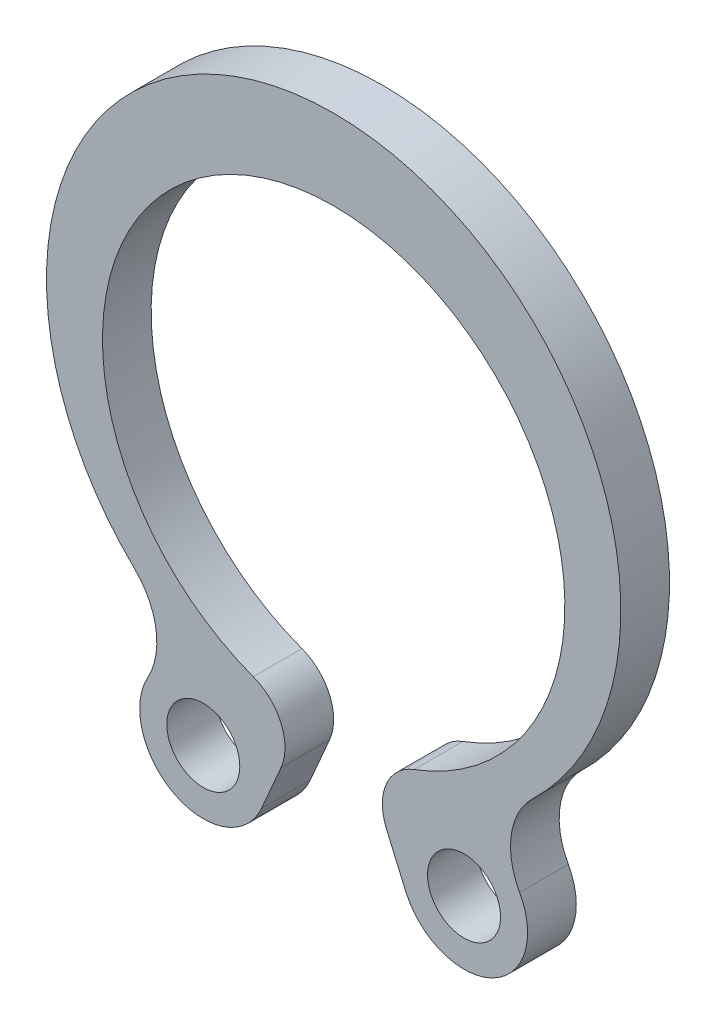
ISO-10303-21;
HEADER;
FILE_DESCRIPTION(('STEP AP214'),'2;1');
FILE_NAME('part.step','',(''),(''),'','','');
FILE_SCHEMA(('AUTOMOTIVE_DESIGN { 1 0 10303 214 1 1 1 1 }'));
ENDSEC;
DATA;
#1=APPLICATION_CONTEXT('core data for automotive mechanical design processes');
#2=APPLICATION_PROTOCOL_DEFINITION('international standard','automotive_design',2000,#1);
#3=PRODUCT_CONTEXT('',#1,'mechanical');
#4=PRODUCT('Part','Part','',(#3));
#5=PRODUCT_RELATED_PRODUCT_CATEGORY('part','',(#4));
#6=PRODUCT_DEFINITION_FORMATION('','',#4);
#7=PRODUCT_DEFINITION_CONTEXT('part definition',#1,'design');
#8=PRODUCT_DEFINITION('design','',#6,#7);
#9=PRODUCT_DEFINITION_SHAPE('','',#8);
#10=(LENGTH_UNIT() NAMED_UNIT(*) SI_UNIT(.MILLI.,.METRE.));
#11=(NAMED_UNIT(*) PLANE_ANGLE_UNIT() SI_UNIT($,.RADIAN.));
#12=(NAMED_UNIT(*) SI_UNIT($,.STERADIAN.) SOLID_ANGLE_UNIT());
#13=UNCERTAINTY_MEASURE_WITH_UNIT(LENGTH_MEASURE(1.E-05),#10,'distance_accuracy_value','');
#14=(GEOMETRIC_REPRESENTATION_CONTEXT(3) GLOBAL_UNCERTAINTY_ASSIGNED_CONTEXT((#13)) GLOBAL_UNIT_ASSIGNED_CONTEXT((#10,
#11,#12)) REPRESENTATION_CONTEXT('',''));
#15=CARTESIAN_POINT('',(0.,0.,0.));
#16=DIRECTION('',(0.,0.,1.));
#17=DIRECTION('',(1.,0.,0.));
#18=AXIS2_PLACEMENT_3D('',#15,#16,#17);
#19=CARTESIAN_POINT('',(-5.13329676060521,-4.83003418071217,1.));
#20=DIRECTION('',(0.,0.,1.));
#21=DIRECTION('',(1.,0.,0.));
#22=AXIS2_PLACEMENT_3D('',#19,#20,#21);
#23=PLANE('',#22);
#24=CARTESIAN_POINT('',(2.67876854259725,-6.18937836291663,1.));
#25=DIRECTION('',(0.,0.,1.));
#26=DIRECTION('',(-1.,0.,0.));
#27=AXIS2_PLACEMENT_3D('',#24,#25,#26);
#28=CIRCLE('',#27,0.75);
#29=CARTESIAN_POINT('',(1.92876854259725,-6.18937836291663,1.));
#30=VERTEX_POINT('',#29);
#31=EDGE_CURVE('E145',#30,#30,#28,.T.);
#32=ORIENTED_EDGE('',*,*,#31,.F.);
#33=EDGE_LOOP('',(#32));
#34=FACE_BOUND('',#33,.T.);
#35=CARTESIAN_POINT('',(-5.13329676060521,-4.83003418071217,1.));
#36=DIRECTION('',(0.,0.,-1.));
#37=DIRECTION('',(1.,0.,0.));
#38=AXIS2_PLACEMENT_3D('',#35,#36,#37);
#39=CIRCLE('',#38,1.5);
#40=CARTESIAN_POINT('',(-4.09276363345551,-3.74962184678403,1.));
#41=VERTEX_POINT('',#40);
#42=CARTESIAN_POINT('',(-3.82109005233728,-5.55674839880387,1.));
#43=VERTEX_POINT('',#42);
#44=EDGE_CURVE('E160',#41,#43,#39,.T.);
#45=ORIENTED_EDGE('',*,*,#44,.T.);
#46=CARTESIAN_POINT('',(-2.67876854259725,-6.18937836291663,1.));
#47=DIRECTION('',(0.,0.,1.));
#48=DIRECTION('',(1.,0.,0.));
#49=AXIS2_PLACEMENT_3D('',#46,#47,#48);
#50=CIRCLE('',#49,1.30580209186081);
#51=CARTESIAN_POINT('',(-1.48038982896834,-6.70803775194686,1.));
#52=VERTEX_POINT('',#51);
#53=EDGE_CURVE('E98',#43,#52,#50,.T.);
#54=ORIENTED_EDGE('',*,*,#53,.T.);
#55=DIRECTION('',(0.397196016351254,0.91773379832863,0.));
#56=VECTOR('',#55,1.);
#57=CARTESIAN_POINT('',(-1.48038982896834,-6.70803775194686,1.));
#58=LINE('',#57,#56);
#59=CARTESIAN_POINT('',(-1.08226620167135,-5.78816067956322,1.));
#60=VERTEX_POINT('',#59);
#61=EDGE_CURVE('E181',#52,#60,#58,.T.);
#62=ORIENTED_EDGE('',*,*,#61,.T.);
#63=CARTESIAN_POINT('',(-2.,-5.39096466321196,1.));
#64=DIRECTION('',(0.,0.,1.));
#65=DIRECTION('',(-1.,0.,0.));
#66=AXIS2_PLACEMENT_3D('',#63,#64,#65);
#67=CIRCLE('',#66,1.00000000000001);
#68=CARTESIAN_POINT('',(-1.65217391304348,-4.453405591349,1.));
#69=VERTEX_POINT('',#68);
#70=EDGE_CURVE('E200',#60,#69,#67,.T.);
#71=ORIENTED_EDGE('',*,*,#70,.T.);
#72=CARTESIAN_POINT('',(0.,0.,1.));
#73=DIRECTION('',(0.,0.,-1.));
#74=DIRECTION('',(1.,0.,0.));
#75=AXIS2_PLACEMENT_3D('',#72,#73,#74);
#76=CIRCLE('',#75,4.75);
#77=CARTESIAN_POINT('',(1.65217391304348,-4.45340559134901,1.));
#78=VERTEX_POINT('',#77);
#79=EDGE_CURVE('E197',#69,#78,#76,.T.);
#80=ORIENTED_EDGE('',*,*,#79,.T.);
#81=CARTESIAN_POINT('',(2.,-5.39096466321196,1.));
#82=DIRECTION('',(0.,0.,1.));
#83=DIRECTION('',(1.,0.,0.));
#84=AXIS2_PLACEMENT_3D('',#81,#82,#83);
#85=CIRCLE('',#84,1.);
#86=CARTESIAN_POINT('',(1.08226620167136,-5.78816067956319,1.));
#87=VERTEX_POINT('',#86);
#88=EDGE_CURVE('E199',#78,#87,#85,.T.);
#89=ORIENTED_EDGE('',*,*,#88,.T.);
#90=DIRECTION('',(0.397196016351241,-0.917733798328636,0.));
#91=VECTOR('',#90,1.);
#92=CARTESIAN_POINT('',(1.08226620167136,-5.78816067956319,1.));
#93=LINE('',#92,#91);
#94=CARTESIAN_POINT('',(1.48038982896834,-6.70803775194686,1.));
#95=VERTEX_POINT('',#94);
#96=EDGE_CURVE('E123',#87,#95,#93,.T.);
#97=ORIENTED_EDGE('',*,*,#96,.T.);
#98=CARTESIAN_POINT('',(2.67876854259725,-6.18937836291663,1.));
#99=DIRECTION('',(0.,0.,1.));
#100=DIRECTION('',(-1.,0.,0.));
#101=AXIS2_PLACEMENT_3D('',#98,#99,#100);
#102=CIRCLE('',#101,1.30580209186081);
#103=CARTESIAN_POINT('',(3.82109005233728,-5.55674839880387,1.));
#104=VERTEX_POINT('',#103);
#105=EDGE_CURVE('E117',#95,#104,#102,.T.);
#106=ORIENTED_EDGE('',*,*,#105,.T.);
#107=CARTESIAN_POINT('',(5.13329676060521,-4.83003418071217,1.));
#108=DIRECTION('',(0.,0.,-1.));
#109=DIRECTION('',(-1.,0.,0.));
#110=AXIS2_PLACEMENT_3D('',#107,#108,#109);
#111=CIRCLE('',#110,1.5);
#112=CARTESIAN_POINT('',(4.09276363345551,-3.74962184678403,1.));
#113=VERTEX_POINT('',#112);
#114=EDGE_CURVE('E121',#104,#113,#111,.T.);
#115=ORIENTED_EDGE('',*,*,#114,.T.);
#116=CARTESIAN_POINT('',(0.,0.5,1.));
#117=DIRECTION('',(0.,0.,1.));
#118=DIRECTION('',(-1.,0.,0.));
#119=AXIS2_PLACEMENT_3D('',#116,#117,#118);
#120=CIRCLE('',#119,5.9);
#121=EDGE_CURVE('E49',#113,#41,#120,.T.);
#122=ORIENTED_EDGE('',*,*,#121,.T.);
#123=EDGE_LOOP('',(#45,#54,#62,#71,#80,#89,#97,#106,#115,#122));
#124=FACE_BOUND('',#123,.T.);
#125=CARTESIAN_POINT('',(-2.67876854259725,-6.18937836291663,1.));
#126=DIRECTION('',(0.,0.,1.));
#127=DIRECTION('',(1.,0.,0.));
#128=AXIS2_PLACEMENT_3D('',#125,#126,#127);
#129=CIRCLE('',#128,0.75);
#130=CARTESIAN_POINT('',(-1.92876854259725,-6.18937836291663,1.));
#131=VERTEX_POINT('',#130);
#132=EDGE_CURVE('E211',#131,#131,#129,.T.);
#133=ORIENTED_EDGE('',*,*,#132,.F.);
#134=EDGE_LOOP('',(#133));
#135=FACE_BOUND('',#134,.T.);
#136=ADVANCED_FACE('F32',(#34,#124,#135),#23,.T.);
#137=CARTESIAN_POINT('',(-5.13329676060521,-4.83003418071217,0.));
#138=DIRECTION('',(0.,0.,1.));
#139=DIRECTION('',(1.,0.,0.));
#140=AXIS2_PLACEMENT_3D('',#137,#138,#139);
#141=PLANE('',#140);
#142=CARTESIAN_POINT('',(-5.13329676060521,-4.83003418071217,0.));
#143=DIRECTION('',(0.,0.,-1.));
#144=DIRECTION('',(1.,0.,0.));
#145=AXIS2_PLACEMENT_3D('',#142,#143,#144);
#146=CIRCLE('',#145,1.5);
#147=CARTESIAN_POINT('',(-4.09276363345551,-3.74962184678403,0.));
#148=VERTEX_POINT('',#147);
#149=CARTESIAN_POINT('',(-3.82109005233728,-5.55674839880387,0.));
#150=VERTEX_POINT('',#149);
#151=EDGE_CURVE('E141',#148,#150,#146,.T.);
#152=ORIENTED_EDGE('',*,*,#151,.F.);
#153=CARTESIAN_POINT('',(0.,0.5,0.));
#154=DIRECTION('',(0.,0.,1.));
#155=DIRECTION('',(-1.,0.,0.));
#156=AXIS2_PLACEMENT_3D('',#153,#154,#155);
#157=CIRCLE('',#156,5.9);
#158=CARTESIAN_POINT('',(4.09276363345551,-3.74962184678403,0.));
#159=VERTEX_POINT('',#158);
#160=EDGE_CURVE('E90',#159,#148,#157,.T.);
#161=ORIENTED_EDGE('',*,*,#160,.F.);
#162=CARTESIAN_POINT('',(5.13329676060521,-4.83003418071217,0.));
#163=DIRECTION('',(0.,0.,-1.));
#164=DIRECTION('',(-1.,0.,0.));
#165=AXIS2_PLACEMENT_3D('',#162,#163,#164);
#166=CIRCLE('',#165,1.5);
#167=CARTESIAN_POINT('',(3.82109005233728,-5.55674839880387,0.));
#168=VERTEX_POINT('',#167);
#169=EDGE_CURVE('E84',#168,#159,#166,.T.);
#170=ORIENTED_EDGE('',*,*,#169,.F.);
#171=CARTESIAN_POINT('',(2.67876854259725,-6.18937836291663,0.));
#172=DIRECTION('',(0.,0.,1.));
#173=DIRECTION('',(-1.,0.,0.));
#174=AXIS2_PLACEMENT_3D('',#171,#172,#173);
#175=CIRCLE('',#174,1.30580209186081);
#176=CARTESIAN_POINT('',(1.48038982896834,-6.70803775194686,0.));
#177=VERTEX_POINT('',#176);
#178=EDGE_CURVE('E131',#177,#168,#175,.T.);
#179=ORIENTED_EDGE('',*,*,#178,.F.);
#180=DIRECTION('',(0.397196016351241,-0.917733798328636,0.));
#181=VECTOR('',#180,1.);
#182=CARTESIAN_POINT('',(1.08226620167136,-5.78816067956319,0.));
#183=LINE('',#182,#181);
#184=CARTESIAN_POINT('',(1.08226620167136,-5.78816067956319,0.));
#185=VERTEX_POINT('',#184);
#186=EDGE_CURVE('E155',#185,#177,#183,.T.);
#187=ORIENTED_EDGE('',*,*,#186,.F.);
#188=CARTESIAN_POINT('',(2.,-5.39096466321196,0.));
#189=DIRECTION('',(0.,0.,1.));
#190=DIRECTION('',(1.,0.,0.));
#191=AXIS2_PLACEMENT_3D('',#188,#189,#190);
#192=CIRCLE('',#191,1.);
#193=CARTESIAN_POINT('',(1.65217391304348,-4.45340559134901,0.));
#194=VERTEX_POINT('',#193);
#195=EDGE_CURVE('E153',#194,#185,#192,.T.);
#196=ORIENTED_EDGE('',*,*,#195,.F.);
#197=CARTESIAN_POINT('',(0.,0.,0.));
#198=DIRECTION('',(0.,0.,-1.));
#199=DIRECTION('',(1.,0.,0.));
#200=AXIS2_PLACEMENT_3D('',#197,#198,#199);
#201=CIRCLE('',#200,4.75);
#202=CARTESIAN_POINT('',(-1.65217391304348,-4.453405591349,0.));
#203=VERTEX_POINT('',#202);
#204=EDGE_CURVE('E151',#203,#194,#201,.T.);
#205=ORIENTED_EDGE('',*,*,#204,.F.);
#206=CARTESIAN_POINT('',(-2.,-5.39096466321196,0.));
#207=DIRECTION('',(0.,0.,1.));
#208=DIRECTION('',(-1.,0.,0.));
#209=AXIS2_PLACEMENT_3D('',#206,#207,#208);
#210=CIRCLE('',#209,1.00000000000001);
#211=CARTESIAN_POINT('',(-1.08226620167135,-5.78816067956322,0.));
#212=VERTEX_POINT('',#211);
#213=EDGE_CURVE('E149',#212,#203,#210,.T.);
#214=ORIENTED_EDGE('',*,*,#213,.F.);
#215=DIRECTION('',(0.397196016351254,0.91773379832863,0.));
#216=VECTOR('',#215,1.);
#217=CARTESIAN_POINT('',(-1.48038982896834,-6.70803775194686,0.));
#218=LINE('',#217,#216);
#219=CARTESIAN_POINT('',(-1.48038982896834,-6.70803775194686,0.));
#220=VERTEX_POINT('',#219);
#221=EDGE_CURVE('E147',#220,#212,#218,.T.);
#222=ORIENTED_EDGE('',*,*,#221,.F.);
#223=CARTESIAN_POINT('',(-2.67876854259725,-6.18937836291663,0.));
#224=DIRECTION('',(0.,0.,1.));
#225=DIRECTION('',(1.,0.,0.));
#226=AXIS2_PLACEMENT_3D('',#223,#224,#225);
#227=CIRCLE('',#226,1.30580209186081);
#228=EDGE_CURVE('E144',#150,#220,#227,.T.);
#229=ORIENTED_EDGE('',*,*,#228,.F.);
#230=EDGE_LOOP('',(#152,#161,#170,#179,#187,#196,#205,#214,#222,#229));
#231=FACE_BOUND('',#230,.T.);
#232=CARTESIAN_POINT('',(2.67876854259725,-6.18937836291663,0.));
#233=DIRECTION('',(0.,0.,1.));
#234=DIRECTION('',(-1.,0.,0.));
#235=AXIS2_PLACEMENT_3D('',#232,#233,#234);
#236=CIRCLE('',#235,0.75);
#237=CARTESIAN_POINT('',(1.92876854259725,-6.18937836291663,0.));
#238=VERTEX_POINT('',#237);
#239=EDGE_CURVE('E208',#238,#238,#236,.T.);
#240=ORIENTED_EDGE('',*,*,#239,.T.);
#241=EDGE_LOOP('',(#240));
#242=FACE_BOUND('',#241,.T.);
#243=CARTESIAN_POINT('',(-2.67876854259725,-6.18937836291663,0.));
#244=DIRECTION('',(0.,0.,1.));
#245=DIRECTION('',(1.,0.,0.));
#246=AXIS2_PLACEMENT_3D('',#243,#244,#245);
#247=CIRCLE('',#246,0.75);
#248=CARTESIAN_POINT('',(-1.92876854259725,-6.18937836291663,0.));
#249=VERTEX_POINT('',#248);
#250=EDGE_CURVE('E214',#249,#249,#247,.T.);
#251=ORIENTED_EDGE('',*,*,#250,.T.);
#252=EDGE_LOOP('',(#251));
#253=FACE_BOUND('',#252,.T.);
#254=ADVANCED_FACE('F185',(#231,#242,#253),#141,.F.);
#255=CARTESIAN_POINT('',(-5.13329676060521,-4.83003418071217,1.));
#256=DIRECTION('',(0.,0.,-1.));
#257=DIRECTION('',(-1.,0.,0.));
#258=AXIS2_PLACEMENT_3D('',#255,#256,#257);
#259=CYLINDRICAL_SURFACE('',#258,1.5);
#260=ORIENTED_EDGE('',*,*,#151,.T.);
#261=DIRECTION('',(0.,0.,-1.));
#262=VECTOR('',#261,1.);
#263=CARTESIAN_POINT('',(-3.82109005233728,-5.55674839880387,1.));
#264=LINE('',#263,#262);
#265=EDGE_CURVE('E11',#43,#150,#264,.T.);
#266=ORIENTED_EDGE('',*,*,#265,.F.);
#267=ORIENTED_EDGE('',*,*,#44,.F.);
#268=DIRECTION('',(0.,0.,-1.));
#269=VECTOR('',#268,1.);
#270=CARTESIAN_POINT('',(-4.09276363345551,-3.74962184678403,1.));
#271=LINE('',#270,#269);
#272=EDGE_CURVE('E137',#41,#148,#271,.T.);
#273=ORIENTED_EDGE('',*,*,#272,.T.);
#274=EDGE_LOOP('',(#260,#266,#267,#273));
#275=FACE_BOUND('',#274,.T.);
#276=ADVANCED_FACE('F34',(#275),#259,.F.);
#277=CARTESIAN_POINT('',(-2.67876854259725,-6.18937836291663,1.));
#278=DIRECTION('',(0.,0.,-1.));
#279=DIRECTION('',(-1.,0.,0.));
#280=AXIS2_PLACEMENT_3D('',#277,#278,#279);
#281=CYLINDRICAL_SURFACE('',#280,1.30580209186081);
#282=ORIENTED_EDGE('',*,*,#228,.T.);
#283=DIRECTION('',(0.,0.,-1.));
#284=VECTOR('',#283,1.);
#285=CARTESIAN_POINT('',(-1.48038982896834,-6.70803775194686,1.));
#286=LINE('',#285,#284);
#287=EDGE_CURVE('E41',#52,#220,#286,.T.);
#288=ORIENTED_EDGE('',*,*,#287,.F.);
#289=ORIENTED_EDGE('',*,*,#53,.F.);
#290=ORIENTED_EDGE('',*,*,#265,.T.);
#291=EDGE_LOOP('',(#282,#288,#289,#290));
#292=FACE_BOUND('',#291,.T.);
#293=ADVANCED_FACE('F254',(#292),#281,.T.);
#294=CARTESIAN_POINT('',(-1.48038982896834,-6.70803775194686,1.));
#295=DIRECTION('',(-0.91773379832863,0.397196016351254,0.));
#296=DIRECTION('',(-0.397196016351254,-0.91773379832863,0.));
#297=AXIS2_PLACEMENT_3D('',#294,#295,#296);
#298=PLANE('',#297);
#299=ORIENTED_EDGE('',*,*,#221,.T.);
#300=DIRECTION('',(0.,0.,-1.));
#301=VECTOR('',#300,1.);
#302=CARTESIAN_POINT('',(-1.08226620167135,-5.78816067956322,1.));
#303=LINE('',#302,#301);
#304=EDGE_CURVE('E173',#60,#212,#303,.T.);
#305=ORIENTED_EDGE('',*,*,#304,.F.);
#306=ORIENTED_EDGE('',*,*,#61,.F.);
#307=ORIENTED_EDGE('',*,*,#287,.T.);
#308=EDGE_LOOP('',(#299,#305,#306,#307));
#309=FACE_BOUND('',#308,.T.);
#310=ADVANCED_FACE('F179',(#309),#298,.F.);
#311=CARTESIAN_POINT('',(-2.,-5.39096466321196,1.));
#312=DIRECTION('',(0.,0.,-1.));
#313=DIRECTION('',(-1.,0.,0.));
#314=AXIS2_PLACEMENT_3D('',#311,#312,#313);
#315=CYLINDRICAL_SURFACE('',#314,1.00000000000001);
#316=ORIENTED_EDGE('',*,*,#213,.T.);
#317=DIRECTION('',(0.,0.,-1.));
#318=VECTOR('',#317,1.);
#319=CARTESIAN_POINT('',(-1.65217391304348,-4.453405591349,1.));
#320=LINE('',#319,#318);
#321=EDGE_CURVE('E170',#69,#203,#320,.T.);
#322=ORIENTED_EDGE('',*,*,#321,.F.);
#323=ORIENTED_EDGE('',*,*,#70,.F.);
#324=ORIENTED_EDGE('',*,*,#304,.T.);
#325=EDGE_LOOP('',(#316,#322,#323,#324));
#326=FACE_BOUND('',#325,.T.);
#327=ADVANCED_FACE('F191',(#326),#315,.T.);
#328=CARTESIAN_POINT('',(0.,0.,1.));
#329=DIRECTION('',(0.,0.,-1.));
#330=DIRECTION('',(-1.,0.,0.));
#331=AXIS2_PLACEMENT_3D('',#328,#329,#330);
#332=CYLINDRICAL_SURFACE('',#331,4.75);
#333=ORIENTED_EDGE('',*,*,#204,.T.);
#334=DIRECTION('',(0.,0.,-1.));
#335=VECTOR('',#334,1.);
#336=CARTESIAN_POINT('',(1.65217391304348,-4.45340559134901,1.));
#337=LINE('',#336,#335);
#338=EDGE_CURVE('E167',#78,#194,#337,.T.);
#339=ORIENTED_EDGE('',*,*,#338,.F.);
#340=ORIENTED_EDGE('',*,*,#79,.F.);
#341=ORIENTED_EDGE('',*,*,#321,.T.);
#342=EDGE_LOOP('',(#333,#339,#340,#341));
#343=FACE_BOUND('',#342,.T.);
#344=ADVANCED_FACE('F195',(#343),#332,.F.);
#345=CARTESIAN_POINT('',(2.,-5.39096466321196,1.));
#346=DIRECTION('',(0.,0.,-1.));
#347=DIRECTION('',(-1.,0.,0.));
#348=AXIS2_PLACEMENT_3D('',#345,#346,#347);
#349=CYLINDRICAL_SURFACE('',#348,1.);
#350=ORIENTED_EDGE('',*,*,#195,.T.);
#351=DIRECTION('',(0.,0.,-1.));
#352=VECTOR('',#351,1.);
#353=CARTESIAN_POINT('',(1.08226620167136,-5.78816067956319,1.));
#354=LINE('',#353,#352);
#355=EDGE_CURVE('E164',#87,#185,#354,.T.);
#356=ORIENTED_EDGE('',*,*,#355,.F.);
#357=ORIENTED_EDGE('',*,*,#88,.F.);
#358=ORIENTED_EDGE('',*,*,#338,.T.);
#359=EDGE_LOOP('',(#350,#356,#357,#358));
#360=FACE_BOUND('',#359,.T.);
#361=ADVANCED_FACE('F244',(#360),#349,.T.);
#362=CARTESIAN_POINT('',(1.08226620167136,-5.78816067956319,1.));
#363=DIRECTION('',(0.917733798328636,0.397196016351241,0.));
#364=DIRECTION('',(-0.397196016351241,0.917733798328636,0.));
#365=AXIS2_PLACEMENT_3D('',#362,#363,#364);
#366=PLANE('',#365);
#367=ORIENTED_EDGE('',*,*,#186,.T.);
#368=DIRECTION('',(0.,0.,-1.));
#369=VECTOR('',#368,1.);
#370=CARTESIAN_POINT('',(1.48038982896834,-6.70803775194686,1.));
#371=LINE('',#370,#369);
#372=EDGE_CURVE('E132',#95,#177,#371,.T.);
#373=ORIENTED_EDGE('',*,*,#372,.F.);
#374=ORIENTED_EDGE('',*,*,#96,.F.);
#375=ORIENTED_EDGE('',*,*,#355,.T.);
#376=EDGE_LOOP('',(#367,#373,#374,#375));
#377=FACE_BOUND('',#376,.T.);
#378=ADVANCED_FACE('F241',(#377),#366,.F.);
#379=CARTESIAN_POINT('',(2.67876854259725,-6.18937836291663,1.));
#380=DIRECTION('',(0.,0.,-1.));
#381=DIRECTION('',(-1.,0.,0.));
#382=AXIS2_PLACEMENT_3D('',#379,#380,#381);
#383=CYLINDRICAL_SURFACE('',#382,1.30580209186081);
#384=ORIENTED_EDGE('',*,*,#178,.T.);
#385=DIRECTION('',(0.,0.,-1.));
#386=VECTOR('',#385,1.);
#387=CARTESIAN_POINT('',(3.82109005233728,-5.55674839880387,1.));
#388=LINE('',#387,#386);
#389=EDGE_CURVE('E128',#104,#168,#388,.T.);
#390=ORIENTED_EDGE('',*,*,#389,.F.);
#391=ORIENTED_EDGE('',*,*,#105,.F.);
#392=ORIENTED_EDGE('',*,*,#372,.T.);
#393=EDGE_LOOP('',(#384,#390,#391,#392));
#394=FACE_BOUND('',#393,.T.);
#395=ADVANCED_FACE('F129',(#394),#383,.T.);
#396=CARTESIAN_POINT('',(5.13329676060521,-4.83003418071217,1.));
#397=DIRECTION('',(0.,0.,-1.));
#398=DIRECTION('',(-1.,0.,0.));
#399=AXIS2_PLACEMENT_3D('',#396,#397,#398);
#400=CYLINDRICAL_SURFACE('',#399,1.5);
#401=ORIENTED_EDGE('',*,*,#169,.T.);
#402=DIRECTION('',(0.,0.,-1.));
#403=VECTOR('',#402,1.);
#404=CARTESIAN_POINT('',(4.09276363345551,-3.74962184678403,1.));
#405=LINE('',#404,#403);
#406=EDGE_CURVE('E133',#113,#159,#405,.T.);
#407=ORIENTED_EDGE('',*,*,#406,.F.);
#408=ORIENTED_EDGE('',*,*,#114,.F.);
#409=ORIENTED_EDGE('',*,*,#389,.T.);
#410=EDGE_LOOP('',(#401,#407,#408,#409));
#411=FACE_BOUND('',#410,.T.);
#412=ADVANCED_FACE('F135',(#411),#400,.F.);
#413=CARTESIAN_POINT('',(0.,0.5,1.));
#414=DIRECTION('',(0.,0.,-1.));
#415=DIRECTION('',(-1.,0.,0.));
#416=AXIS2_PLACEMENT_3D('',#413,#414,#415);
#417=CYLINDRICAL_SURFACE('',#416,5.9);
#418=ORIENTED_EDGE('',*,*,#160,.T.);
#419=ORIENTED_EDGE('',*,*,#272,.F.);
#420=ORIENTED_EDGE('',*,*,#121,.F.);
#421=ORIENTED_EDGE('',*,*,#406,.T.);
#422=EDGE_LOOP('',(#418,#419,#420,#421));
#423=FACE_BOUND('',#422,.T.);
#424=ADVANCED_FACE('F234',(#423),#417,.T.);
#425=CARTESIAN_POINT('',(2.67876854259725,-6.18937836291663,1.));
#426=DIRECTION('',(0.,0.,-1.));
#427=DIRECTION('',(-1.,0.,0.));
#428=AXIS2_PLACEMENT_3D('',#425,#426,#427);
#429=CYLINDRICAL_SURFACE('',#428,0.75);
#430=ORIENTED_EDGE('',*,*,#31,.T.);
#431=EDGE_LOOP('',(#430));
#432=FACE_BOUND('',#431,.T.);
#433=ORIENTED_EDGE('',*,*,#239,.F.);
#434=EDGE_LOOP('',(#433));
#435=FACE_BOUND('',#434,.T.);
#436=ADVANCED_FACE('F231',(#432,#435),#429,.F.);
#437=CARTESIAN_POINT('',(-2.67876854259725,-6.18937836291663,1.));
#438=DIRECTION('',(0.,0.,-1.));
#439=DIRECTION('',(-1.,0.,0.));
#440=AXIS2_PLACEMENT_3D('',#437,#438,#439);
#441=CYLINDRICAL_SURFACE('',#440,0.75);
#442=ORIENTED_EDGE('',*,*,#132,.T.);
#443=EDGE_LOOP('',(#442));
#444=FACE_BOUND('',#443,.T.);
#445=ORIENTED_EDGE('',*,*,#250,.F.);
#446=EDGE_LOOP('',(#445));
#447=FACE_BOUND('',#446,.T.);
#448=ADVANCED_FACE('F220',(#444,#447),#441,.F.);
#449=CLOSED_SHELL('',(#136,#254,#276,#293,#310,#327,#344,#361,#378,#395,#412,#424,#436,#448));
#450=MANIFOLD_SOLID_BREP('B2',#449);
#451=ADVANCED_BREP_SHAPE_REPRESENTATION('',(#18,#450),#14);
#452=SHAPE_DEFINITION_REPRESENTATION(#9,#451);
ENDSEC;
END-ISO-10303-21;
